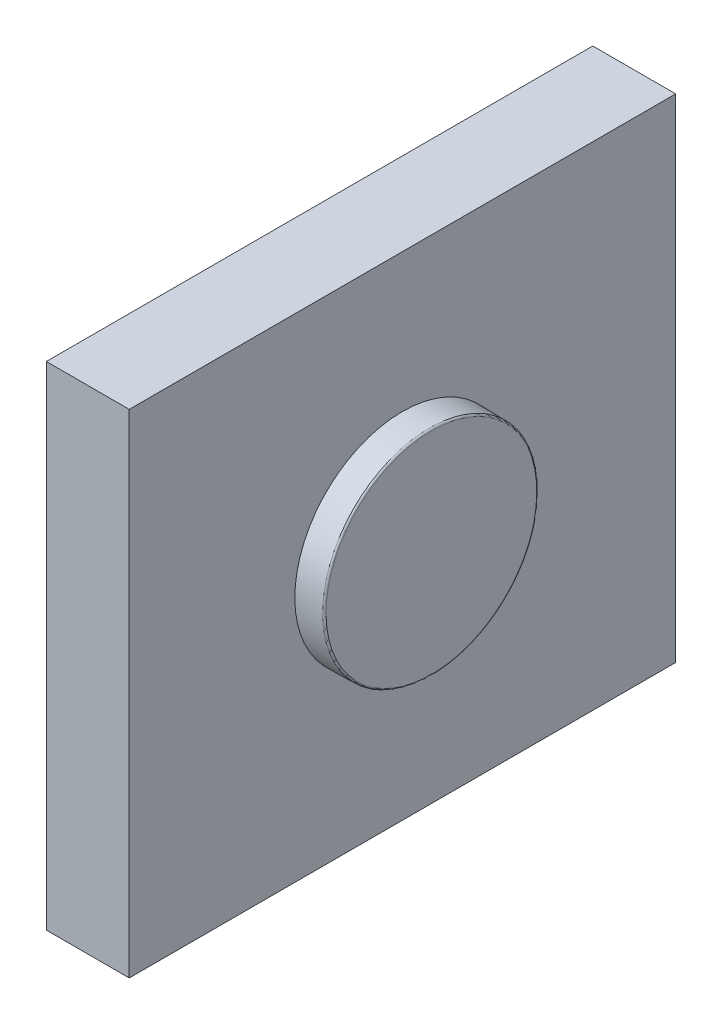
ISO-10303-21;
HEADER;
FILE_DESCRIPTION(('STEP AP214'),'2;1');
FILE_NAME('part.step','',(''),(''),'','','');
FILE_SCHEMA(('AUTOMOTIVE_DESIGN { 1 0 10303 214 1 1 1 1 }'));
ENDSEC;
DATA;
#1=APPLICATION_CONTEXT('core data for automotive mechanical design processes');
#2=APPLICATION_PROTOCOL_DEFINITION('international standard','automotive_design',2000,#1);
#3=PRODUCT_CONTEXT('',#1,'mechanical');
#4=PRODUCT('Part','Part','',(#3));
#5=PRODUCT_RELATED_PRODUCT_CATEGORY('part','',(#4));
#6=PRODUCT_DEFINITION_FORMATION('','',#4);
#7=PRODUCT_DEFINITION_CONTEXT('part definition',#1,'design');
#8=PRODUCT_DEFINITION('design','',#6,#7);
#9=PRODUCT_DEFINITION_SHAPE('','',#8);
#10=(LENGTH_UNIT() NAMED_UNIT(*) SI_UNIT(.MILLI.,.METRE.));
#11=(NAMED_UNIT(*) PLANE_ANGLE_UNIT() SI_UNIT($,.RADIAN.));
#12=(NAMED_UNIT(*) SI_UNIT($,.STERADIAN.) SOLID_ANGLE_UNIT());
#13=UNCERTAINTY_MEASURE_WITH_UNIT(LENGTH_MEASURE(1.E-05),#10,'distance_accuracy_value','');
#14=(GEOMETRIC_REPRESENTATION_CONTEXT(3) GLOBAL_UNCERTAINTY_ASSIGNED_CONTEXT((#13)) GLOBAL_UNIT_ASSIGNED_CONTEXT((#10,
#11,#12)) REPRESENTATION_CONTEXT('',''));
#15=CARTESIAN_POINT('',(0.,0.,0.));
#16=DIRECTION('',(0.,0.,1.));
#17=DIRECTION('',(1.,0.,0.));
#18=AXIS2_PLACEMENT_3D('',#15,#16,#17);
#19=CARTESIAN_POINT('',(3.30455824157118,-14.0999745457946,11.5154919140192));
#20=CARTESIAN_POINT('',(2.99733170822694,-14.0946118867074,11.5101292549321));
#21=CARTESIAN_POINT('',(2.99733170822694,-13.8773037425713,11.292821110796));
#22=CARTESIAN_POINT('',(3.30455824157118,-14.0902557384874,11.5252107213264));
#23=CARTESIAN_POINT('',(2.99733170822694,-14.0846590263841,11.5200821152553));
#24=CARTESIAN_POINT('',(2.99733170822694,-13.8578661279569,11.3122587254104));
#25=CARTESIAN_POINT('',(3.30458047281811,-14.0811745209178,11.5355671183712));
#26=CARTESIAN_POINT('',(2.99733170822694,-14.0753735914654,11.5307037719797));
#27=CARTESIAN_POINT('',(2.99733170822694,-13.839702916722,11.3329707434043));
#28=CARTESIAN_POINT('',(3.30466901694962,-14.0644426349507,11.5573778764094));
#29=CARTESIAN_POINT('',(2.99733170822694,-14.0583089623048,11.5530866657326));
#30=CARTESIAN_POINT('',(2.99733170822694,-13.8062360537007,11.3765891683934));
#31=CARTESIAN_POINT('',(3.30473533028792,-14.0567919812785,11.5688322487027));
#32=CARTESIAN_POINT('',(2.99733170822694,-14.0505288243675,11.564849600091));
#33=CARTESIAN_POINT('',(2.99733170822694,-13.790932431349,11.3994955979729));
#34=CARTESIAN_POINT('',(3.30491090350627,-14.0430521123824,11.5926429591094));
#35=CARTESIAN_POINT('',(2.99733170822694,-14.0366139478835,11.5892982140442));
#36=CARTESIAN_POINT('',(2.99733170822694,-13.763446564273,11.4471108895023));
#37=CARTESIAN_POINT('',(3.30502016424023,-14.0369629282086,11.6049993151525));
#38=CARTESIAN_POINT('',(2.99733170822694,-14.03047876267,11.6019857927267));
#39=CARTESIAN_POINT('',(2.99733170822694,-13.7512643816191,11.4718197872821));
#40=CARTESIAN_POINT('',(3.30527976238351,-14.0264501693481,11.6304025668908));
#41=CARTESIAN_POINT('',(2.99733170822694,-14.0199606767225,11.6280499980418));
#42=CARTESIAN_POINT('',(2.99733170822694,-13.7302298012931,11.5226172281539));
#43=CARTESIAN_POINT('',(3.30543010094776,-14.0220266415006,11.6434494819933));
#44=CARTESIAN_POINT('',(2.99733170822694,-14.0155778596557,11.6414285867946));
#45=CARTESIAN_POINT('',(2.99733170822694,-13.7213774972593,11.54870581002));
#46=CARTESIAN_POINT('',(3.30576928214731,-14.0149208676755,11.6700106154456));
#47=CARTESIAN_POINT('',(2.99733170822694,-14.0086371444044,11.6686293152508));
#48=CARTESIAN_POINT('',(2.99733170822694,-13.7071541087495,11.6018162360649));
#49=CARTESIAN_POINT('',(3.30595812610835,-14.0122386816659,11.683524849872));
#50=CARTESIAN_POINT('',(2.99733170822694,-14.0060798547881,11.6824533377279));
#51=CARTESIAN_POINT('',(2.99733170822694,-13.7017831441631,11.6288381123505));
#52=CARTESIAN_POINT('',(3.30637108680139,-14.0086614723867,11.7107893944333));
#53=CARTESIAN_POINT('',(2.99733170822694,-14.0028274535773,11.7102929101257));
#54=CARTESIAN_POINT('',(2.99733170822694,-13.6946143090933,11.6833527849617));
#55=CARTESIAN_POINT('',(3.30659520488778,-14.0077665177581,11.7245397136149));
#56=CARTESIAN_POINT('',(2.99733170822694,-14.0021334319874,11.7243101281065));
#57=CARTESIAN_POINT('',(2.99733170822694,-13.6928165758445,11.7108455993334));
#58=CARTESIAN_POINT('',(3.30707487912995,-14.0077790771294,11.7520411641532));
#59=CARTESIAN_POINT('',(2.99733170822694,-14.0026091944632,11.7522828706944));
#60=CARTESIAN_POINT('',(2.99733170822694,-13.692824949097,11.7658317549199));
#61=CARTESIAN_POINT('',(3.30733043653528,-14.008686662792,11.7657922955205));
#62=CARTESIAN_POINT('',(2.99733170822694,-14.003780472096,11.7662397302609));
#63=CARTESIAN_POINT('',(2.99733170822694,-13.69463119888,11.7933250961123));
#64=CARTESIAN_POINT('',(3.30786861691192,-14.0122887727411,11.7930600945936));
#65=CARTESIAN_POINT('',(2.99733170822694,-14.0079534272236,11.7938425689324));
#66=CARTESIAN_POINT('',(2.99733170822694,-13.7018166308313,11.8478419063117));
#67=CARTESIAN_POINT('',(3.30815124092218,-14.0149833656439,11.8065767532758));
#68=CARTESIAN_POINT('',(2.99733170822694,-14.0109568957503,11.8074894569731));
#69=CARTESIAN_POINT('',(2.99733170822694,-13.707195950196,11.8748653572352));
#70=CARTESIAN_POINT('',(3.30873871898789,-14.0221133901359,11.8331443424987));
#71=CARTESIAN_POINT('',(2.99733170822694,-14.018727202453,11.8342321845069));
#72=CARTESIAN_POINT('',(2.99733170822694,-13.7214354902445,11.9279800267454));
#73=CARTESIAN_POINT('',(3.3090435738083,-14.0265488816513,11.8461952569904));
#74=CARTESIAN_POINT('',(2.99733170822694,-14.0234960029918,11.8473284458178));
#75=CARTESIAN_POINT('',(2.99733170822694,-13.7302958307539,11.9540712132075));
#76=CARTESIAN_POINT('',(3.30967029765055,-14.0370848217454,11.871608059793));
#77=CARTESIAN_POINT('',(2.99733170822694,-14.0346984679467,11.8727433751853));
#78=CARTESIAN_POINT('',(2.99733170822694,-13.7513458319314,12.004874939802));
#79=CARTESIAN_POINT('',(3.30999216715035,-14.0431853171168,11.8839699287275));
#80=CARTESIAN_POINT('',(2.99733170822694,-14.0411341293682,11.8850619524873));
#81=CARTESIAN_POINT('',(2.99733170822694,-13.7635355861681,12.0295874411649));
#82=CARTESIAN_POINT('',(3.31064741338044,-14.0569468987431,11.9077931279435));
#83=CARTESIAN_POINT('',(2.99733170822694,-14.0555431276732,11.9087126990408));
#84=CARTESIAN_POINT('',(2.99733170822694,-13.7910358746898,12.0772109648659));
#85=CARTESIAN_POINT('',(3.31098079033928,-14.0646080160096,11.9192544403235));
#86=CARTESIAN_POINT('',(2.99733170822694,-14.0635183589527,11.9200442762058));
#87=CARTESIAN_POINT('',(2.99733170822694,-13.80634647099,12.100121951393));
#88=CARTESIAN_POINT('',(3.31165334756795,-14.0813597746928,11.9410804175859));
#89=CARTESIAN_POINT('',(2.99733170822694,-14.0808539466462,11.9415334526264));
#90=CARTESIAN_POINT('',(2.99733170822694,-13.8398265092961,12.1437504268576));
#91=CARTESIAN_POINT('',(3.31199252789744,-14.0904504308138,11.951445071186));
#92=CARTESIAN_POINT('',(2.99733170822694,-14.0902159667458,11.9516900047324));
#93=CARTESIAN_POINT('',(2.99733170822694,-13.8579959807088,12.1644678932285));
#94=CARTESIAN_POINT('',(3.31267088855643,-14.109905740535,11.9709003809072));
#95=CARTESIAN_POINT('',(2.99733170822694,-14.1101509372219,11.9706656635041));
#96=CARTESIAN_POINT('',(2.99733170822694,-13.8968829184925,12.2033548310122));
#97=CARTESIAN_POINT('',(3.31301006888592,-14.1202703941352,11.9799910370282));
#98=CARTESIAN_POINT('',(2.99733170822694,-14.120725210342,11.9794833451178));
#99=CARTESIAN_POINT('',(2.99733170822694,-13.9176003848635,12.2215243024249));
#100=CARTESIAN_POINT('',(3.31368262611459,-14.1420963713975,11.9967427957114));
#101=CARTESIAN_POINT('',(2.99733170822694,-14.1428928220549,11.9956440617984));
#102=CARTESIAN_POINT('',(2.99733170822694,-13.961228860328,12.2550043407311));
#103=CARTESIAN_POINT('',(3.31401600307344,-14.1535576837775,12.004403912978));
#104=CARTESIAN_POINT('',(2.99733170822694,-14.1544870572149,12.0029853957888));
#105=CARTESIAN_POINT('',(2.99733170822694,-13.9841398468551,12.2703149370312));
#106=CARTESIAN_POINT('',(3.31467124930352,-14.1773808829935,12.0181654946043));
#107=CARTESIAN_POINT('',(2.99733170822694,-14.1784891497553,12.0160839494885));
#108=CARTESIAN_POINT('',(2.99733170822694,-14.0317633705561,12.2978152255529));
#109=CARTESIAN_POINT('',(3.31499311880332,-14.189742751928,12.0242659899756));
#110=CARTESIAN_POINT('',(2.99733170822694,-14.190897422397,12.021839311037));
#111=CARTESIAN_POINT('',(2.99733170822694,-14.056475871919,12.3100049797896));
#112=CARTESIAN_POINT('',(3.31561984264557,-14.2151555547306,12.0348019300698));
#113=CARTESIAN_POINT('',(2.99733170822694,-14.2163126433581,12.0316849826122));
#114=CARTESIAN_POINT('',(2.99733170822694,-14.1072795985135,12.3310549809672));
#115=CARTESIAN_POINT('',(3.31592469746598,-14.2282064692223,12.0392374215851));
#116=CARTESIAN_POINT('',(2.99733170822694,-14.2293195034521,12.0357734048924));
#117=CARTESIAN_POINT('',(2.99733170822694,-14.1333707849756,12.3399153214765));
#118=CARTESIAN_POINT('',(3.3165121755317,-14.2547740584452,12.0463674460772));
#119=CARTESIAN_POINT('',(2.99733170822694,-14.2557113898018,12.0422329742294));
#120=CARTESIAN_POINT('',(2.99733170822694,-14.1864854544858,12.354154861525));
#121=CARTESIAN_POINT('',(3.31679479954195,-14.2682907171274,12.04906203898));
#122=CARTESIAN_POINT('',(2.99733170822694,-14.2690958356381,12.0446023312957));
#123=CARTESIAN_POINT('',(2.99733170822694,-14.2135089054093,12.3595341808897));
#124=CARTESIAN_POINT('',(3.3173329799186,-14.2955585162005,12.0526641489291));
#125=CARTESIAN_POINT('',(2.99733170822694,-14.2960205296551,12.0475999082714));
#126=CARTESIAN_POINT('',(2.99733170822694,-14.2680257156087,12.366719612841));
#127=CARTESIAN_POINT('',(3.31758853732392,-14.3093096475678,12.0535717345917));
#128=CARTESIAN_POINT('',(2.99733170822694,-14.3095597483079,12.0482265548042));
#129=CARTESIAN_POINT('',(2.99733170822694,-14.2955190568011,12.3685258626241));
#130=CARTESIAN_POINT('',(3.31806821156609,-14.3368110981062,12.053584293963));
#131=CARTESIAN_POINT('',(2.99733170822694,-14.3365731772341,12.0477424198455));
#132=CARTESIAN_POINT('',(2.99733170822694,-14.3505052123877,12.3685342358766));
#133=CARTESIAN_POINT('',(3.31829232965248,-14.3505614172877,12.0526893393343));
#134=CARTESIAN_POINT('',(2.99733170822694,-14.3500459801195,12.0466303845373));
#135=CARTESIAN_POINT('',(2.99733170822694,-14.3779980267593,12.3667365026278));
#136=CARTESIAN_POINT('',(3.31870529034552,-14.377825961849,12.0491121300551));
#137=CARTESIAN_POINT('',(2.99733170822694,-14.3767103868924,12.0426990405606));
#138=CARTESIAN_POINT('',(2.99733170822694,-14.4325126993705,12.359567667558));
#139=CARTESIAN_POINT('',(3.31889413430657,-14.3913401962755,12.0464299440455));
#140=CARTESIAN_POINT('',(2.99733170822694,-14.3899002997207,12.0398788785423));
#141=CARTESIAN_POINT('',(2.99733170822694,-14.4595345756561,12.3541967029716));
#142=CARTESIAN_POINT('',(3.31923331550611,-14.4179013297278,12.0393241702205));
#143=CARTESIAN_POINT('',(2.99733170822694,-14.4157900746607,12.0325865239954));
#144=CARTESIAN_POINT('',(2.99733170822694,-14.512645001701,12.3399733144618));
#145=CARTESIAN_POINT('',(3.31938365407036,-14.4309482448302,12.0349006423729));
#146=CARTESIAN_POINT('',(2.99733170822694,-14.4284880727735,12.0281139329069));
#147=CARTESIAN_POINT('',(2.99733170822694,-14.5387335835671,12.3311210104279));
#148=CARTESIAN_POINT('',(3.31964325221364,-14.4563514965686,12.0243878835124));
#149=CARTESIAN_POINT('',(2.99733170822694,-14.4531948973129,12.0175955547803));
#150=CARTESIAN_POINT('',(2.99733170822694,-14.589531024439,12.3100864301019));
#151=CARTESIAN_POINT('',(3.3197525129476,-14.4687078526117,12.0182986993386));
#152=CARTESIAN_POINT('',(2.99733170822694,-14.4652018069409,12.0115498489016));
#153=CARTESIAN_POINT('',(2.99733170822694,-14.6142399222187,12.297904247448));
#154=CARTESIAN_POINT('',(3.31992808616596,-14.4925185630183,12.0045588304426));
#155=CARTESIAN_POINT('',(2.99733170822694,-14.488339174554,11.9979861058774));
#156=CARTESIAN_POINT('',(2.99733170822694,-14.6618552137481,12.270418380372));
#157=CARTESIAN_POINT('',(3.31999439950425,-14.5039729353117,11.9969081767704));
#158=CARTESIAN_POINT('',(2.99733170822694,-14.499467785049,11.9904686241233));
#159=CARTESIAN_POINT('',(2.99733170822694,-14.6847616433276,12.2551147580204));
#160=CARTESIAN_POINT('',(3.32008294363576,-14.5257836933498,11.9801762908033));
#161=CARTESIAN_POINT('',(2.99733170822694,-14.520675006054,11.9740826464054));
#162=CARTESIAN_POINT('',(2.99733170822694,-14.7283800683168,12.221647894999));
#163=CARTESIAN_POINT('',(3.3201051748827,-14.5361400903946,11.9710950732337));
#164=CARTESIAN_POINT('',(2.99733170822694,-14.5307519551113,11.9652151448818));
#165=CARTESIAN_POINT('',(2.99733170822694,-14.7490920863106,12.2034846837641));
#166=CARTESIAN_POINT('',(3.3201051748827,-14.555577705009,11.9516574586193));
#167=CARTESIAN_POINT('',(2.99733170822694,-14.5496977766572,11.9462693233359));
#168=CARTESIAN_POINT('',(2.99733170822694,-14.7879673155394,12.1646094545353));
#169=CARTESIAN_POINT('',(3.32008294363576,-14.5646589225786,11.9413010615745));
#170=CARTESIAN_POINT('',(2.99733170822694,-14.5585652781807,11.9361923742787));
#171=CARTESIAN_POINT('',(2.99733170822694,-14.8061305267743,12.1438974365414));
#172=CARTESIAN_POINT('',(3.31999439950425,-14.5813908085457,11.9194903035364));
#173=CARTESIAN_POINT('',(2.99733170822694,-14.5749512558986,11.9149851532737));
#174=CARTESIAN_POINT('',(2.99733170822694,-14.8395973897957,12.1002790115523));
#175=CARTESIAN_POINT('',(3.31992808616596,-14.5890414622179,11.908035931243));
#176=CARTESIAN_POINT('',(2.99733170822694,-14.5824687376527,11.9038565427787));
#177=CARTESIAN_POINT('',(2.99733170822694,-14.8549010121473,12.0773725819728));
#178=CARTESIAN_POINT('',(3.3197525129476,-14.602781331114,11.8842252208364));
#179=CARTESIAN_POINT('',(2.99733170822694,-14.5960324806769,11.8807191751656));
#180=CARTESIAN_POINT('',(2.99733170822694,-14.8823868792233,12.0297572904434));
#181=CARTESIAN_POINT('',(3.31964325221364,-14.6088705152877,11.8718688647933));
#182=CARTESIAN_POINT('',(2.99733170822694,-14.6020781865556,11.8687122655376));
#183=CARTESIAN_POINT('',(2.99733170822694,-14.8945690618772,12.0050483926636));
#184=CARTESIAN_POINT('',(3.31938365407036,-14.6193832741483,11.8464656130549));
#185=CARTESIAN_POINT('',(2.99733170822694,-14.6125965646822,11.8440054409981));
#186=CARTESIAN_POINT('',(2.99733170822694,-14.9156036422032,11.9542509517918));
#187=CARTESIAN_POINT('',(3.31923331550611,-14.6238068019958,11.8334186979524));
#188=CARTESIAN_POINT('',(2.99733170822694,-14.6170691557708,11.8313074428854));
#189=CARTESIAN_POINT('',(2.99733170822694,-14.9244559462371,11.9281623699257));
#190=CARTESIAN_POINT('',(3.31889413430657,-14.6309125758208,11.8068575645001));
#191=CARTESIAN_POINT('',(2.99733170822694,-14.6243615103176,11.8054176679454));
#192=CARTESIAN_POINT('',(2.99733170822694,-14.9386793347469,11.8750519438808));
#193=CARTESIAN_POINT('',(3.31870529034552,-14.6335947618304,11.7933433300737));
#194=CARTESIAN_POINT('',(2.99733170822694,-14.627181672336,11.792227755117));
#195=CARTESIAN_POINT('',(2.99733170822694,-14.9440502993333,11.8480300675952));
#196=CARTESIAN_POINT('',(3.31829232965248,-14.6371719711096,11.7660787855124));
#197=CARTESIAN_POINT('',(2.99733170822694,-14.6311130163126,11.7655633483442));
#198=CARTESIAN_POINT('',(2.99733170822694,-14.9512191344031,11.793515394984));
#199=CARTESIAN_POINT('',(3.31806821156609,-14.6380669257383,11.7523284663308));
#200=CARTESIAN_POINT('',(2.99733170822694,-14.6322250516209,11.7520905454588));
#201=CARTESIAN_POINT('',(2.99733170822694,-14.9530168676519,11.7660225806123));
#202=CARTESIAN_POINT('',(3.31758853732392,-14.638054366367,11.7248270157925));
#203=CARTESIAN_POINT('',(2.99733170822694,-14.6327091865795,11.7250771165326));
#204=CARTESIAN_POINT('',(2.99733170822694,-14.9530084943994,11.7110364250258));
#205=CARTESIAN_POINT('',(3.3173329799186,-14.6371467807044,11.7110758844252));
#206=CARTESIAN_POINT('',(2.99733170822694,-14.6320825400467,11.7115378978798));
#207=CARTESIAN_POINT('',(2.99733170822694,-14.9512022446164,11.6835430838334));
#208=CARTESIAN_POINT('',(3.31679479954195,-14.6335446707553,11.6838080853521));
#209=CARTESIAN_POINT('',(2.99733170822694,-14.629084963071,11.6846132038628));
#210=CARTESIAN_POINT('',(2.99733170822694,-14.944016812665,11.629026273634));
#211=CARTESIAN_POINT('',(3.3165121755317,-14.6308500778525,11.6702914266699));
#212=CARTESIAN_POINT('',(2.99733170822694,-14.6267156060047,11.6712287580265));
#213=CARTESIAN_POINT('',(2.99733170822694,-14.9386374933003,11.6020028227105));
#214=CARTESIAN_POINT('',(3.31592469746598,-14.6237200533604,11.643723837447));
#215=CARTESIAN_POINT('',(2.99733170822694,-14.6202560366677,11.6448368716768));
#216=CARTESIAN_POINT('',(2.99733170822694,-14.9243979532518,11.5488881532003));
#217=CARTESIAN_POINT('',(3.31561984264557,-14.6192845618451,11.6306729229553));
#218=CARTESIAN_POINT('',(2.99733170822694,-14.6161676143876,11.6318300115828));
#219=CARTESIAN_POINT('',(2.99733170822694,-14.9155376127425,11.5227969667382));
#220=CARTESIAN_POINT('',(3.31499311880332,-14.608748621751,11.6052601201527));
#221=CARTESIAN_POINT('',(2.99733170822694,-14.6063219428123,11.6064147906217));
#222=CARTESIAN_POINT('',(2.99733170822694,-14.8944876115649,11.4719932401437));
#223=CARTESIAN_POINT('',(3.31467124930352,-14.6026481263796,11.5928982512182));
#224=CARTESIAN_POINT('',(2.99733170822694,-14.6005665812638,11.59400651798));
#225=CARTESIAN_POINT('',(2.99733170822694,-14.8822978573282,11.4472807387808));
#226=CARTESIAN_POINT('',(3.31401600307344,-14.5888865447533,11.5690750520022));
#227=CARTESIAN_POINT('',(2.99733170822694,-14.5874680275641,11.5700044254396));
#228=CARTESIAN_POINT('',(2.99733170822694,-14.8547975688066,11.3996572150798));
#229=CARTESIAN_POINT('',(3.31368262611459,-14.5812254274867,11.5576137396222));
#230=CARTESIAN_POINT('',(2.99733170822694,-14.5801266935737,11.5584101902796));
#231=CARTESIAN_POINT('',(2.99733170822694,-14.8394869725064,11.3767462285527));
#232=CARTESIAN_POINT('',(3.31301006888592,-14.5644736688036,11.5357877623599));
#233=CARTESIAN_POINT('',(2.99733170822694,-14.5639659768931,11.5362425785667));
#234=CARTESIAN_POINT('',(2.99733170822694,-14.8060069342002,11.3331177530882));
#235=CARTESIAN_POINT('',(3.31267088855643,-14.5553830126825,11.5254231087597));
#236=CARTESIAN_POINT('',(2.99733170822694,-14.5551482952794,11.5256683054466));
#237=CARTESIAN_POINT('',(2.99733170822694,-14.7878374627875,11.3124002867172));
#238=CARTESIAN_POINT('',(3.31199252789744,-14.5359277029613,11.5059677990385));
#239=CARTESIAN_POINT('',(2.99733170822694,-14.5361726365077,11.5057333349705));
#240=CARTESIAN_POINT('',(2.99733170822694,-14.7489505250039,11.2735133489335));
#241=CARTESIAN_POINT('',(3.31165334756795,-14.5255630493612,11.4968771429175));
#242=CARTESIAN_POINT('',(2.99733170822694,-14.5260160844017,11.4963713148709));
#243=CARTESIAN_POINT('',(2.99733170822694,-14.7282330586329,11.2553438775208));
#244=CARTESIAN_POINT('',(3.31098079033928,-14.5037370720988,11.4801253842343));
#245=CARTESIAN_POINT('',(2.99733170822694,-14.5045269079811,11.4790357271774));
#246=CARTESIAN_POINT('',(2.99733170822694,-14.6846045831683,11.2218638392147));
#247=CARTESIAN_POINT('',(3.31064741338044,-14.4922757597188,11.4724642669678));
#248=CARTESIAN_POINT('',(2.99733170822694,-14.4931953308162,11.4710604958978));
#249=CARTESIAN_POINT('',(2.99733170822694,-14.6616935966412,11.2065532429145));
#250=CARTESIAN_POINT('',(3.30999216715035,-14.4684525605028,11.4587026853414));
#251=CARTESIAN_POINT('',(2.99733170822694,-14.4695445842627,11.4566514975928));
#252=CARTESIAN_POINT('',(2.99733170822694,-14.6140700729402,11.1790529543928));
#253=CARTESIAN_POINT('',(3.30967029765055,-14.4560906915683,11.4526021899701));
#254=CARTESIAN_POINT('',(2.99733170822694,-14.4572260069606,11.4502158361714));
#255=CARTESIAN_POINT('',(2.99733170822694,-14.5893575715773,11.1668632001561));
#256=CARTESIAN_POINT('',(3.3090435738083,-14.4306778887657,11.4420662498759));
#257=CARTESIAN_POINT('',(2.99733170822694,-14.4318110775931,11.4390133712165));
#258=CARTESIAN_POINT('',(2.99733170822694,-14.5385538449828,11.1458131989786));
#259=CARTESIAN_POINT('',(3.30873871898789,-14.417626974274,11.4376307583606));
#260=CARTESIAN_POINT('',(2.99733170822694,-14.4187148162822,11.4342445706777));
#261=CARTESIAN_POINT('',(2.99733170822694,-14.5124626585207,11.1369528584692));
#262=CARTESIAN_POINT('',(3.30815124092218,-14.3910593850511,11.4305007338686));
#263=CARTESIAN_POINT('',(2.99733170822694,-14.3919720887484,11.4264742639749));
#264=CARTESIAN_POINT('',(2.99733170822694,-14.4593479890105,11.1227133184207));
#265=CARTESIAN_POINT('',(3.30786861691192,-14.3775427263689,11.4278061409657));
#266=CARTESIAN_POINT('',(2.99733170822694,-14.3783252007077,11.4234707954483));
#267=CARTESIAN_POINT('',(2.99733170822694,-14.432324538087,11.117333999056));
#268=CARTESIAN_POINT('',(3.30733043653528,-14.3502749272958,11.4242040310167));
#269=CARTESIAN_POINT('',(2.99733170822694,-14.3507223620362,11.4192978403206));
#270=CARTESIAN_POINT('',(2.99733170822694,-14.3778077278877,11.1101485671047));
#271=CARTESIAN_POINT('',(3.30707487912995,-14.3365237959285,11.423296445354));
#272=CARTESIAN_POINT('',(2.99733170822694,-14.3367655024697,11.4181265626879));
#273=CARTESIAN_POINT('',(2.99733170822694,-14.3503143866953,11.1083423173216));
#274=CARTESIAN_POINT('',(3.30659520488778,-14.3090223453902,11.4232838859828));
#275=CARTESIAN_POINT('',(2.99733170822694,-14.3087927598819,11.4176508002121));
#276=CARTESIAN_POINT('',(2.99733170822694,-14.2953282311087,11.1083339440692));
#277=CARTESIAN_POINT('',(3.30637108680139,-14.2952720262086,11.4241788406114));
#278=CARTESIAN_POINT('',(2.99733170822694,-14.294775541901,11.418344821802));
#279=CARTESIAN_POINT('',(2.99733170822694,-14.267835416737,11.1101316773179));
#280=CARTESIAN_POINT('',(3.30595812610835,-14.2680074816473,11.4277560498906));
#281=CARTESIAN_POINT('',(2.99733170822694,-14.2669359695032,11.4215972230128));
#282=CARTESIAN_POINT('',(2.99733170822694,-14.2133207441258,11.1173005123878));
#283=CARTESIAN_POINT('',(3.30576928214731,-14.2544932472209,11.4304382359002));
#284=CARTESIAN_POINT('',(2.99733170822694,-14.2531119470261,11.4241545126291));
#285=CARTESIAN_POINT('',(2.99733170822694,-14.1862988678402,11.1226714769741));
#286=CARTESIAN_POINT('',(3.30543010094776,-14.2279321137686,11.4375440097252));
#287=CARTESIAN_POINT('',(2.99733170822694,-14.22591121857,11.4310952278804));
#288=CARTESIAN_POINT('',(2.99733170822694,-14.1331884417953,11.136894865484));
#289=CARTESIAN_POINT('',(3.30527976238351,-14.2148851986661,11.4419675375728));
#290=CARTESIAN_POINT('',(2.99733170822694,-14.2125326298171,11.4354780449472));
#291=CARTESIAN_POINT('',(2.99733170822694,-14.1070998599292,11.1457471695178));
#292=CARTESIAN_POINT('',(3.30502016424023,-14.1894819469278,11.4524802964333));
#293=CARTESIAN_POINT('',(2.99733170822694,-14.186468424502,11.4459961308946));
#294=CARTESIAN_POINT('',(2.99733170822694,-14.0563024190574,11.1667817498438));
#295=CARTESIAN_POINT('',(3.30491090350627,-14.1771255908847,11.4585694806071));
#296=CARTESIAN_POINT('',(2.99733170822694,-14.1737808458195,11.4521313161082));
#297=CARTESIAN_POINT('',(2.99733170822694,-14.0315935212776,11.1789639324977));
#298=CARTESIAN_POINT('',(3.30473533028792,-14.153314880478,11.4723093495031));
#299=CARTESIAN_POINT('',(2.99733170822694,-14.1493322318663,11.4660461925922));
#300=CARTESIAN_POINT('',(2.99733170822694,-13.9839782297482,11.2064497995737));
#301=CARTESIAN_POINT('',(3.30466901694962,-14.1418605081847,11.4799600031753));
#302=CARTESIAN_POINT('',(2.99733170822694,-14.1375692975079,11.4738263305294));
#303=CARTESIAN_POINT('',(2.99733170822694,-13.9610718001687,11.2217534219254));
#304=CARTESIAN_POINT('',(3.30458047281811,-14.1200497501465,11.4966918891425));
#305=CARTESIAN_POINT('',(2.99733170822694,-14.115186403755,11.4908909596901));
#306=CARTESIAN_POINT('',(2.99733170822694,-13.9174533751796,11.2552202849467));
#307=CARTESIAN_POINT('',(3.30455824157118,-14.1096933531018,11.5057731067121));
#308=CARTESIAN_POINT('',(2.99733170822694,-14.1045647470306,11.5001763946088));
#309=CARTESIAN_POINT('',(2.99733170822694,-13.8967413571857,11.2733834961816));
#310=CARTESIAN_POINT('',(3.30455824157118,-14.0999745457946,11.5154919140192));
#311=CARTESIAN_POINT('',(2.99733170822694,-14.0946118867074,11.5101292549321));
#312=CARTESIAN_POINT('',(2.99733170822694,-13.8773037425713,11.292821110796));
#313=(BOUNDED_SURFACE() B_SPLINE_SURFACE(3,2,((#19,#20,#21),(#22,#23,#24),(#25,#26,#27),(#28,
#29,#30),(#31,#32,#33),(#34,#35,#36),(#37,#38,#39),(#40,#41,#42),(#43,#44,#45),(#46,#47,#48),
(#49,#50,#51),(#52,#53,#54),(#55,#56,#57),(#58,#59,#60),(#61,#62,#63),(#64,#65,#66),(#67,#68,
#69),(#70,#71,#72),(#73,#74,#75),(#76,#77,#78),(#79,#80,#81),(#82,#83,#84),(#85,#86,#87),(#88,
#89,#90),(#91,#92,#93),(#94,#95,#96),(#97,#98,#99),(#100,#101,#102),(#103,#104,#105),(#106,#107,
#108),(#109,#110,#111),(#112,#113,#114),(#115,#116,#117),(#118,#119,#120),(#121,#122,#123),
(#124,#125,#126),(#127,#128,#129),(#130,#131,#132),(#133,#134,#135),(#136,#137,#138),(#139,#140,
#141),(#142,#143,#144),(#145,#146,#147),(#148,#149,#150),(#151,#152,#153),(#154,#155,#156),
(#157,#158,#159),(#160,#161,#162),(#163,#164,#165),(#166,#167,#168),(#169,#170,#171),(#172,#173,
#174),(#175,#176,#177),(#178,#179,#180),(#181,#182,#183),(#184,#185,#186),(#187,#188,#189),
(#190,#191,#192),(#193,#194,#195),(#196,#197,#198),(#199,#200,#201),(#202,#203,#204),(#205,#206,
#207),(#208,#209,#210),(#211,#212,#213),(#214,#215,#216),(#217,#218,#219),(#220,#221,#222),
(#223,#224,#225),(#226,#227,#228),(#229,#230,#231),(#232,#233,#234),(#235,#236,#237),(#238,#239,
#240),(#241,#242,#243),(#244,#245,#246),(#247,#248,#249),(#250,#251,#252),(#253,#254,#255),
(#256,#257,#258),(#259,#260,#261),(#262,#263,#264),(#265,#266,#267),(#268,#269,#270),(#271,#272,
#273),(#274,#275,#276),(#277,#278,#279),(#280,#281,#282),(#283,#284,#285),(#286,#287,#288),
(#289,#290,#291),(#292,#293,#294),(#295,#296,#297),(#298,#299,#300),(#301,#302,#303),(#304,#305,
#306),(#307,#308,#309),(#310,#311,#312)),.UNSPECIFIED.,.T.,.F.,
.F.) B_SPLINE_SURFACE_WITH_KNOTS((4,2,2,2,2,2,2,2,2,2,2,2,2,2,2,2,2,2,2,2,2,2,2,2,2,2,2,2,2,2,2,
2,2,2,2,2,2,2,2,2,2,2,2,2,2,2,2,2,4),(3,3),(0.,0.082408050231093,0.16481694867164,
0.247227485702298,0.329640339993695,0.412056032249538,0.494474889728135,0.576897023958396,
0.659322323164037,0.741750459905647,0.824180913413239,0.90661300508247,0.989045944713775,
1.07147888434508,1.15391097601431,1.2363414295219,1.31876956626351,1.40119486546915,
1.48361699969941,1.56603585717801,1.64845154943385,1.73086440372525,1.81327494075591,
1.89568383919646,1.97809188942755,2.06049993965864,2.14290883809919,2.22531937512985,
2.30773222942124,2.39014792167709,2.47256677915568,2.55498891338595,2.63741421259158,
2.7198423493332,2.80227280284079,2.88470489451002,2.96713783414132,3.04957077377263,
3.13200286544186,3.21443331894945,3.29686145569106,3.3792867548967,3.46170888912696,
3.54412774660556,3.6265434388614,3.7089562931528,3.79136683018346,3.873775728624,
3.9561837788551),(0.,1.),
.UNSPECIFIED.) GEOMETRIC_REPRESENTATION_ITEM() RATIONAL_B_SPLINE_SURFACE(((1.,0.715778482466135,
1.),(1.,0.715778482466135,1.),(1.,0.715753833868982,1.),(1.,0.715655646535189,1.),(1.,
0.715582107295334,1.),(1.,0.715387352806817,1.),(1.,0.71526613661021,1.),(1.,0.714978031499939,
1.),(1.,0.714811141302122,1.),(1.,0.714434450975085,1.),(1.,0.714224649368419,1.),(1.,
0.713765617309684,1.),(1.,0.713516385343637,1.),(1.,0.712982639560073,1.),(1.,0.712698124340239,
1.),(1.,0.712098561803638,1.),(1.,0.711783513314872,1.),(1.,0.711128163431651,1.),(1.,
0.710787861168225,1.),(1.,0.710087729595666,1.),(1.,0.709727899737965,1.),(1.,0.708994794200322,
1.),(1.,0.708621518253308,1.),(1.,0.707867858380458,1.),(1.,0.707487474381542,1.),(1.,
0.706726087991553,1.),(1.,0.706345085600479,1.),(1.,0.705588994264329,1.),(1.,0.705213905258464,
1.),(1.,0.704476102404387,1.),(1.,0.704113388310393,1.),(1.,0.703406613526652,1.),(1.,
0.703062552312924,1.),(1.,0.702399065867517,1.),(1.,0.702079639788169,1.),(1.,0.701471001675621,
1.),(1.,0.701181788482731,1.),(1.,0.700638646504842,1.),(1.,0.700384716317543,1.),(1.,
0.699916607781164,1.),(1.,0.699702427905825,1.),(1.,0.699317599454815,1.),(1.,0.699146949380409,
1.),(1.,0.698852199255561,1.),(1.,0.698728097896375,1.),(1.,0.698528644529639,1.),(1.,
0.698453291552842,1.),(1.,0.698352671854052,1.),(1.,0.698327404616543,1.),(1.,0.698327404616543,
1.),(1.,0.698352671854052,1.),(1.,0.698453291552842,1.),(1.,0.698528644529639,1.),(1.,
0.698728097896375,1.),(1.,0.698852199255561,1.),(1.,0.699146949380409,1.),(1.,0.699317599454815,
1.),(1.,0.699702427905825,1.),(1.,0.699916607781164,1.),(1.,0.700384716317543,1.),(1.,
0.700638646504842,1.),(1.,0.701181788482731,1.),(1.,0.701471001675621,1.),(1.,0.702079639788169,
1.),(1.,0.702399065867518,1.),(1.,0.703062552312924,1.),(1.,0.703406613526652,1.),(1.,
0.704113388310393,1.),(1.,0.704476102404387,1.),(1.,0.705213905258464,1.),(1.,0.705588994264329,
1.),(1.,0.706345085600479,1.),(1.,0.706726087991553,1.),(1.,0.707487474381542,1.),(1.,
0.707867858380458,1.),(1.,0.708621518253308,1.),(1.,0.708994794200322,1.),(1.,0.709727899737965,
1.),(1.,0.710087729595666,1.),(1.,0.710787861168225,1.),(1.,0.711128163431651,1.),(1.,
0.711783513314872,1.),(1.,0.712098561803638,1.),(1.,0.712698124340239,1.),(1.,0.712982639560073,
1.),(1.,0.713516385343637,1.),(1.,0.713765617309684,1.),(1.,0.714224649368419,1.),(1.,
0.714434450975085,1.),(1.,0.714811141302122,1.),(1.,0.714978031499939,1.),(1.,0.71526613661021,
1.),(1.,0.715387352806817,1.),(1.,0.715582107295334,1.),(1.,0.715655646535189,1.),(1.,
0.715753833868982,1.),(1.,0.715778482466135,1.),(1.,0.715778482466135,1.))) REPRESENTATION_ITEM('') SURFACE());
#314=CARTESIAN_POINT('',(2.9981178531854,-14.975230678364,11.7331736822297));
#315=CARTESIAN_POINT('',(3.01620558276822,-15.2324646044217,11.934527838102));
#316=CARTESIAN_POINT('',(2.68940150429625,-15.2458011929031,11.9267057881607));
#317=CARTESIAN_POINT('',(2.99783968951035,-14.9713828022377,11.7427916398663));
#318=CARTESIAN_POINT('',(3.01278984863509,-15.2264294617777,11.9423458627476));
#319=CARTESIAN_POINT('',(2.68884517806609,-15.2379009235372,11.9368490715194));
#320=CARTESIAN_POINT('',(2.99764308393129,-14.9674276601913,11.7525692617771));
#321=CARTESIAN_POINT('',(3.00949435698679,-15.2201885053103,11.9504130608206));
#322=CARTESIAN_POINT('',(2.68845196744198,-15.2299845434874,11.9469875456374));
#323=CARTESIAN_POINT('',(2.99738910270893,-14.9592598530574,11.7724343456522));
#324=CARTESIAN_POINT('',(3.00319873135287,-15.2073613676677,11.9669534965554));
#325=CARTESIAN_POINT('',(2.68794400543991,-15.2141290799712,11.9672440380184));
#326=CARTESIAN_POINT('',(2.99733164087084,-14.955047349056,11.7825216118781));
#327=CARTESIAN_POINT('',(3.00019540205761,-15.2007780135112,11.975423474563));
#328=CARTESIAN_POINT('',(2.68782908167277,-15.2061900136117,11.9773620650637));
#329=CARTESIAN_POINT('',(2.99733186578278,-14.9404716863137,11.8167258231229));
#330=CARTESIAN_POINT('',(2.99073381540766,-15.1783593021113,12.004194655342));
#331=CARTESIAN_POINT('',(2.6878295310612,-15.1796419453877,12.0111163779756));
#332=CARTESIAN_POINT('',(2.99764679988872,-14.9294262288932,11.8415409609662));
#333=CARTESIAN_POINT('',(2.98487079095874,-15.1616371827411,12.0255425290245));
#334=CARTESIAN_POINT('',(2.68845939875228,-15.1609815485971,12.0347108278366));
#335=CARTESIAN_POINT('',(2.99856693142854,-14.904986177689,11.892582130563));
#336=CARTESIAN_POINT('',(2.97491189223467,-15.1265290002825,12.0700797061108));
#337=CARTESIAN_POINT('',(2.69029966348077,-15.1235525899636,12.0817945364924));
#338=CARTESIAN_POINT('',(2.999172223195,-14.8915908213583,11.9188086183813));
#339=CARTESIAN_POINT('',(2.97076972035731,-15.1081206720566,12.0933020647256));
#340=CARTESIAN_POINT('',(2.69151024918423,-15.1047839949279,12.1052837585954));
#341=CARTESIAN_POINT('',(3.00032812404751,-14.8618495613136,11.9719143310516));
#342=CARTESIAN_POINT('',(2.96422323748085,-15.0700179950547,12.1410654781956));
#343=CARTESIAN_POINT('',(2.69382204490088,-15.0671260420912,12.1521921512371));
#344=CARTESIAN_POINT('',(3.00087870528665,-14.8455021668581,11.9987938797282));
#345=CARTESIAN_POINT('',(2.96177889561309,-15.0502424255744,12.1657122524982));
#346=CARTESIAN_POINT('',(2.69492319921505,-15.0482366279483,12.1756112802775));
#347=CARTESIAN_POINT('',(3.00164899290768,-14.8097352996963,12.0519318037364));
#348=CARTESIAN_POINT('',(2.95855442004474,-15.0099960726173,12.2155605935774));
#349=CARTESIAN_POINT('',(2.6964637966053,-15.010350565328,12.2223774215052));
#350=CARTESIAN_POINT('',(3.00186879931674,-14.7903167576768,12.078190364491));
#351=CARTESIAN_POINT('',(2.95774972413799,-14.9893874239145,12.2409353245948));
#352=CARTESIAN_POINT('',(2.69690343972407,-14.9913539510133,12.2457244533628));
#353=CARTESIAN_POINT('',(3.00186939211221,-14.7490155237546,12.1287418907572));
#354=CARTESIAN_POINT('',(2.95774743868786,-14.9481609738514,12.2913888199734));
#355=CARTESIAN_POINT('',(2.69690462536915,-14.9532418469227,12.292366454519));
#356=CARTESIAN_POINT('',(3.00164967013414,-14.7271300061422,12.153032546352));
#357=CARTESIAN_POINT('',(2.95855169566503,-14.927377976678,12.3166693985603));
#358=CARTESIAN_POINT('',(2.69646515109638,-14.9341262450166,12.3156613322979));
#359=CARTESIAN_POINT('',(3.00087871012628,-14.6821372514896,12.1987209213356));
#360=CARTESIAN_POINT('',(2.96177863160139,-14.8865046765106,12.3660950713069));
#361=CARTESIAN_POINT('',(2.69492320890537,-14.8958053338294,12.3621572128452));
#362=CARTESIAN_POINT('',(3.00032741251183,-14.659029795546,12.220118119919));
#363=CARTESIAN_POINT('',(2.96422574431571,-14.8662715800528,12.3904104943734));
#364=CARTESIAN_POINT('',(2.69382062182473,-14.8766000090405,12.3853581979863));
#365=CARTESIAN_POINT('',(2.99917131703155,-14.6129081079617,12.2598467538555));
#366=CARTESIAN_POINT('',(2.97077593705887,-14.8270545466381,12.4372706726031));
#367=CARTESIAN_POINT('',(2.69150843685679,-14.8381301013975,12.4316148576607));
#368=CARTESIAN_POINT('',(2.99856664417276,-14.5898937839265,12.278185076427));
#369=CARTESIAN_POINT('',(2.97491613814354,-14.8079807131933,12.4599195479625));
#370=CARTESIAN_POINT('',(2.69029908900702,-14.8188657539098,12.4546707430073));
#371=CARTESIAN_POINT('',(2.99764663504131,-14.544764918204,12.312288764094));
#372=CARTESIAN_POINT('',(2.98487133532906,-14.7713478897585,12.503179862245));
#373=CARTESIAN_POINT('',(2.68845906902051,-14.7802021673668,12.5007099715082));
#374=CARTESIAN_POINT('',(2.99733138431898,-14.5226506444075,12.3280533672919));
#375=CARTESIAN_POINT('',(2.99073359612574,-14.7537620493832,12.5238182483916));
#376=CARTESIAN_POINT('',(2.68782856798519,-14.7608028901339,12.5236932912134));
#377=CARTESIAN_POINT('',(2.99733206714005,-14.4774480764048,12.3592109093096));
#378=CARTESIAN_POINT('',(3.00480808941555,-14.7184742038098,12.5650181083082));
#379=CARTESIAN_POINT('',(2.68782993458347,-14.719769254814,12.572042706777));
#380=CARTESIAN_POINT('',(2.99771989549346,-14.4545127999341,12.3743795608682));
#381=CARTESIAN_POINT('',(3.0132433717987,-14.7010331910159,12.5852446805653));
#382=CARTESIAN_POINT('',(2.68860559184716,-14.6981199205675,12.5973978809628));
#383=CARTESIAN_POINT('',(2.99967511109234,-14.4105027397716,12.4030054877051));
#384=CARTESIAN_POINT('',(3.03184377285082,-14.6684922391577,12.622794768116));
#385=CARTESIAN_POINT('',(2.69251602092695,-14.6547711274478,12.6478396950284));
#386=CARTESIAN_POINT('',(3.00124094418344,-14.3894255455877,12.41646499056));
#387=CARTESIAN_POINT('',(3.04204737918744,-14.6534542137089,12.6400419843485));
#388=CARTESIAN_POINT('',(2.69564768443853,-14.6330717721396,12.6729266445901));
#389=CARTESIAN_POINT('',(3.0059244800398,-14.3487095825993,12.4424257840835));
#390=CARTESIAN_POINT('',(3.06400102649719,-14.625572074892,12.6718985704508));
#391=CARTESIAN_POINT('',(2.70501476366383,-14.5893863329092,12.7230900724609));
#392=CARTESIAN_POINT('',(3.0090695367223,-14.3291034281361,12.454905535872));
#393=CARTESIAN_POINT('',(3.07578866714265,-14.6128660414396,12.6863443139067));
#394=CARTESIAN_POINT('',(2.71130488744361,-14.5674020945756,12.7481582782884));
#395=CARTESIAN_POINT('',(3.01718261595185,-14.2915957748011,12.4789181659543));
#396=CARTESIAN_POINT('',(3.10028891080907,-14.5899779710821,12.7123095720557));
#397=CARTESIAN_POINT('',(2.72753101702843,-14.5237536134271,12.7975797957015));
#398=CARTESIAN_POINT('',(3.02216049343966,-14.2737041628045,12.4904455051197));
#399=CARTESIAN_POINT('',(3.11299876568601,-14.5799025502901,12.7237062051639));
#400=CARTESIAN_POINT('',(2.73748673244341,-14.5020917717034,12.8219284592354));
#401=CARTESIAN_POINT('',(3.02816859966666,-14.2566957441842,12.5015730157849));
#402=CARTESIAN_POINT('',(3.12564927752701,-14.5712594513793,12.7335020559467));
#403=CARTESIAN_POINT('',(2.7495028482973,-14.4808210550683,12.8456566294655));
#404=(BOUNDED_SURFACE() B_SPLINE_SURFACE(3,2,((#314,#315,#316),(#317,#318,#319),(#320,#321,
#322),(#323,#324,#325),(#326,#327,#328),(#329,#330,#331),(#332,#333,#334),(#335,#336,#337),
(#338,#339,#340),(#341,#342,#343),(#344,#345,#346),(#347,#348,#349),(#350,#351,#352),(#353,#354,
#355),(#356,#357,#358),(#359,#360,#361),(#362,#363,#364),(#365,#366,#367),(#368,#369,#370),
(#371,#372,#373),(#374,#375,#376),(#377,#378,#379),(#380,#381,#382),(#383,#384,#385),(#386,#387,
#388),(#389,#390,#391),(#392,#393,#394),(#395,#396,#397),(#398,#399,#400),(#401,#402,#403)),
.UNSPECIFIED.,.F.,.F.,.F.) B_SPLINE_SURFACE_WITH_KNOTS((4,2,2,2,2,2,2,2,2,2,2,2,2,2,4),(3,3),
(0.,0.0379777418180279,0.0759319517003511,0.164712330743736,0.253521572675701,0.342375788196757,
0.43120312857069,0.520133267251504,0.609079391591948,0.697822463766481,0.786591759081429,
0.884954463064144,0.983187623145886,1.0831842242364,1.18372654435939),(0.,1.),
.UNSPECIFIED.) GEOMETRIC_REPRESENTATION_ITEM() RATIONAL_B_SPLINE_SURFACE(((1.,0.693582027381874,
1.),(1.,0.696884248928797,1.),(1.,0.700187878362159,1.),(1.,0.706756921936459,1.),(1.,
0.710022358488146,1.),(1.,0.720800808891037,1.),(1.,0.728146009323312,1.),(1.,0.741736361504173,
1.),(1.,0.747981154845798,1.),(1.,0.758511903139352,1.),(1.,0.762796864521066,1.),(1.,
0.7686196933796,1.),(1.,0.770158391359745,1.),(1.,0.770162687188209,1.),(1.,0.768624726531424,
1.),(1.,0.762797206203938,1.),(1.,0.758507151968553,1.),(1.,0.747971813291936,1.),(1.,
0.741731014738621,1.),(1.,0.728144729435476,1.),(1.,0.720798916800658,1.),(1.,0.704886038848527,
1.),(1.,0.69627278587501,1.),(1.,0.679193972477445,1.),(1.,0.670728232481622,1.),(1.,
0.654151560018434,1.),(1.,0.646049725073477,1.),(1.,0.630493785655155,1.),(1.,0.623043457386953,
1.),(1.,0.61602812962293,1.))) REPRESENTATION_ITEM('') SURFACE());
#405=CARTESIAN_POINT('',(2.68233170822694,-14.9506824550095,11.7927650355593));
#406=DIRECTION('',(0.,-0.618207491253544,-0.786014947541075));
#407=DIRECTION('',(0.,0.786014947541075,-0.618207491253544));
#408=AXIS2_PLACEMENT_3D('',#405,#406,#407);
#409=CIRCLE('',#408,0.315);
#410=CARTESIAN_POINT('',(2.99733170822694,-14.9506824550095,11.7927650355593));
#411=VERTEX_POINT('',#410);
#412=CARTESIAN_POINT('',(2.68782921625453,-15.1982394536116,11.9874707361657));
#413=VERTEX_POINT('',#412);
#414=EDGE_CURVE('E108',#411,#413,#409,.T.);
#415=ORIENTED_EDGE('',*,*,#414,.F.);
#416=CARTESIAN_POINT('',(2.99733170822694,-14.5012080440151,12.342833576046));
#417=CARTESIAN_POINT('',(2.99733170822694,-14.5037167836068,12.3415631416299));
#418=CARTESIAN_POINT('',(2.99733170822694,-14.5062206970961,12.3402822846229));
#419=CARTESIAN_POINT('',(2.99733170822694,-14.5555007287638,12.3148167974151));
#420=CARTESIAN_POINT('',(2.99733170822694,-14.6005286882167,12.286977909878));
#421=CARTESIAN_POINT('',(2.99733170822694,-14.6848243373815,12.2234761451049));
#422=CARTESIAN_POINT('',(2.99733170822694,-14.7240837375105,12.187802188677));
#423=CARTESIAN_POINT('',(2.99733170822694,-14.793035464313,12.1116505433807));
#424=CARTESIAN_POINT('',(2.99733170822694,-14.8231313730594,12.0715386294776));
#425=CARTESIAN_POINT('',(2.99733170822694,-14.8755421048716,11.9866067930639));
#426=CARTESIAN_POINT('',(2.99733170822694,-14.8978663861359,11.9417926803044));
#427=CARTESIAN_POINT('',(2.99733170822694,-14.9286957049945,11.8645433770307));
#428=CARTESIAN_POINT('',(2.99733170822694,-14.9393286303803,11.8329279887915));
#429=CARTESIAN_POINT('',(2.99733170822694,-14.9491807122664,11.7981860679849));
#430=CARTESIAN_POINT('',(2.99733170822694,-14.9499370554412,11.795476978777));
#431=CARTESIAN_POINT('',(2.99733170822694,-14.9506824550095,11.7927650355593));
#432=B_SPLINE_CURVE_WITH_KNOTS('',3,(#416,#417,#418,#419,#420,#421,#422,#423,#424,#425,#426,
#427,#428,#429,#430,#431),.UNSPECIFIED.,.F.,.F.,(4,2,2,2,2,2,2,4),(0.,0.00843736990361897,
0.166390018863506,0.324567475767856,0.474160490840271,0.623570807018792,0.72346288653596,
0.731900840726843),.UNSPECIFIED.);
#433=CARTESIAN_POINT('',(2.99733170822671,-14.5012080440152,12.3428335760461));
#434=VERTEX_POINT('',#433);
#435=EDGE_CURVE('E116',#411,#434,#432,.F.);
#436=ORIENTED_EDGE('',*,*,#435,.T.);
#437=CARTESIAN_POINT('',(2.68233170822679,-14.5012080440151,12.342833576046));
#438=DIRECTION('',(0.,0.647067108125698,0.762433051212922));
#439=DIRECTION('',(0.,-0.762433051212922,0.647067108125698));
#440=AXIS2_PLACEMENT_3D('',#437,#438,#439);
#441=CIRCLE('',#440,0.315);
#442=CARTESIAN_POINT('',(2.68782921625453,-14.7413378766395,12.5466286713973));
#443=VERTEX_POINT('',#442);
#444=EDGE_CURVE('E106',#443,#434,#441,.T.);
#445=ORIENTED_EDGE('',*,*,#444,.F.);
#446=CARTESIAN_POINT('',(2.7495028482973,-14.4808210550683,12.8456566294655));
#447=CARTESIAN_POINT('',(2.73748673244341,-14.5020917717034,12.8219284592354));
#448=CARTESIAN_POINT('',(2.72753101702843,-14.5237536134271,12.7975797957015));
#449=CARTESIAN_POINT('',(2.71130488744361,-14.5674020945756,12.7481582782884));
#450=CARTESIAN_POINT('',(2.70501476366383,-14.5893863329092,12.7230900724609));
#451=CARTESIAN_POINT('',(2.69564768443853,-14.6330717721396,12.6729266445901));
#452=CARTESIAN_POINT('',(2.69251602092695,-14.6547711274478,12.6478396950284));
#453=CARTESIAN_POINT('',(2.68860559184716,-14.6981199205675,12.5973978809628));
#454=CARTESIAN_POINT('',(2.68782993458347,-14.719769254814,12.572042706777));
#455=CARTESIAN_POINT('',(2.68782856798519,-14.7608028901339,12.5236932912134));
#456=CARTESIAN_POINT('',(2.68845906902051,-14.7802021673668,12.5007099715082));
#457=CARTESIAN_POINT('',(2.69029908900702,-14.8188657539098,12.4546707430073));
#458=CARTESIAN_POINT('',(2.69150843685679,-14.8381301013975,12.4316148576607));
#459=CARTESIAN_POINT('',(2.69382062182474,-14.8766000090405,12.3853581979863));
#460=CARTESIAN_POINT('',(2.69492320890537,-14.8958053338294,12.3621572128452));
#461=CARTESIAN_POINT('',(2.69646515109639,-14.9341262450166,12.3156613322979));
#462=CARTESIAN_POINT('',(2.69690462536915,-14.9532418469227,12.292366454519));
#463=CARTESIAN_POINT('',(2.69690343972407,-14.9913539510133,12.2457244533628));
#464=CARTESIAN_POINT('',(2.6964637966053,-15.010350565328,12.2223774215052));
#465=CARTESIAN_POINT('',(2.69492319921505,-15.0482366279483,12.1756112802775));
#466=CARTESIAN_POINT('',(2.69382204490088,-15.0671260420912,12.1521921512371));
#467=CARTESIAN_POINT('',(2.69151024918423,-15.1047839949279,12.1052837585954));
#468=CARTESIAN_POINT('',(2.69029966348077,-15.1235525899636,12.0817945364924));
#469=CARTESIAN_POINT('',(2.68845939875228,-15.1609815485971,12.0347108278366));
#470=CARTESIAN_POINT('',(2.6878295310612,-15.1796419453877,12.0111163779756));
#471=CARTESIAN_POINT('',(2.68782908167277,-15.2061900136117,11.9773620650637));
#472=CARTESIAN_POINT('',(2.68794400543991,-15.2141290799712,11.9672440380184));
#473=CARTESIAN_POINT('',(2.68845196744198,-15.2299845434874,11.9469875456374));
#474=CARTESIAN_POINT('',(2.68884517806609,-15.2379009235372,11.9368490715194));
#475=CARTESIAN_POINT('',(2.68940150429625,-15.2458011929031,11.9267057881607));
#476=B_SPLINE_CURVE_WITH_KNOTS('',3,(#446,#447,#448,#449,#450,#451,#452,#453,#454,#455,#456,
#457,#458,#459,#460,#461,#462,#463,#464,#465,#466,#467,#468,#469,#470,#471,#472,#473,#474,#475),
.UNSPECIFIED.,.F.,.F.,(4,2,2,2,2,2,2,2,2,2,2,2,2,2,4),(0.,0.100542320122987,0.200538921213504,
0.298772081295247,0.397134785277961,0.48590408059291,0.574647152767442,0.663593277107887,
0.752523415788701,0.841350756162633,0.930204971683689,1.01901421361565,1.10779459265904,
1.14574880254136,1.18372654435939),.UNSPECIFIED.);
#477=EDGE_CURVE('E111',#443,#413,#476,.T.);
#478=ORIENTED_EDGE('',*,*,#477,.T.);
#479=EDGE_LOOP('',(#415,#436,#445,#478));
#480=FACE_BOUND('',#479,.T.);
#481=ADVANCED_FACE('F46',(#480),#404,.T.);
#482=CARTESIAN_POINT('',(2.99733170822694,0.0308780040211293,0.00963936420355748));
#483=DIRECTION('',(1.,0.,0.));
#484=DIRECTION('',(0.,0.,-1.));
#485=AXIS2_PLACEMENT_3D('',#482,#483,#484);
#486=PLANE('',#485);
#487=ORIENTED_EDGE('',*,*,#435,.F.);
#488=CARTESIAN_POINT('',(2.99733170822694,0.0308780040211293,0.00963936420355748));
#489=DIRECTION('',(1.,0.,0.));
#490=DIRECTION('',(0.,0.,-1.));
#491=AXIS2_PLACEMENT_3D('',#488,#489,#490);
#492=CIRCLE('',#491,19.0601470187025);
#493=EDGE_CURVE('E121',#434,#411,#492,.F.);
#494=ORIENTED_EDGE('',*,*,#493,.F.);
#495=EDGE_LOOP('',(#487,#494));
#496=FACE_BOUND('',#495,.T.);
#497=ADVANCED_FACE('F184',(#496),#486,.T.);
#498=CARTESIAN_POINT('',(2.68233170822694,0.0308780040211293,0.00963936420355748));
#499=DIRECTION('',(1.,0.,0.));
#500=DIRECTION('',(0.,0.,-1.));
#501=AXIS2_PLACEMENT_3D('',#498,#499,#500);
#502=TOROIDAL_SURFACE('',#501,19.0601470187025,0.315);
#503=ORIENTED_EDGE('',*,*,#414,.T.);
#504=CARTESIAN_POINT('',(2.68782921625453,0.0308780040211293,0.00963936420355748));
#505=DIRECTION('',(1.,0.,0.));
#506=DIRECTION('',(0.,0.,-1.));
#507=AXIS2_PLACEMENT_3D('',#504,#505,#506);
#508=CIRCLE('',#507,19.3750990426767);
#509=EDGE_CURVE('E98',#413,#443,#508,.T.);
#510=ORIENTED_EDGE('',*,*,#509,.T.);
#511=ORIENTED_EDGE('',*,*,#444,.T.);
#512=ORIENTED_EDGE('',*,*,#493,.T.);
#513=EDGE_LOOP('',(#503,#510,#511,#512));
#514=FACE_BOUND('',#513,.T.);
#515=ADVANCED_FACE('F103',(#514),#502,.T.);
#516=CARTESIAN_POINT('',(-0.189318345291359,0.0308780040211293,0.00963936420355748));
#517=DIRECTION('',(-1.,0.,0.));
#518=DIRECTION('',(0.,0.,-1.));
#519=AXIS2_PLACEMENT_3D('',#516,#517,#518);
#520=CONICAL_SURFACE('',#519,19.4253198401716,0.0174532925199433);
#521=ORIENTED_EDGE('',*,*,#509,.F.);
#522=ORIENTED_EDGE('',*,*,#477,.F.);
#523=EDGE_LOOP('',(#521,#522));
#524=FACE_BOUND('',#523,.T.);
#525=CARTESIAN_POINT('',(-2.25266829177306,0.0308780040211293,0.00963936420355748));
#526=DIRECTION('',(1.,0.,0.));
#527=DIRECTION('',(0.,0.,-1.));
#528=AXIS2_PLACEMENT_3D('',#525,#526,#527);
#529=CIRCLE('',#528,19.461335747457);
#530=CARTESIAN_POINT('',(-2.25266829177306,0.0308780040211293,-19.4516963832535));
#531=VERTEX_POINT('',#530);
#532=EDGE_CURVE('E124',#531,#531,#529,.F.);
#533=ORIENTED_EDGE('',*,*,#532,.F.);
#534=EDGE_LOOP('',(#533));
#535=FACE_BOUND('',#534,.T.);
#536=ADVANCED_FACE('F112',(#524,#535),#520,.T.);
#537=CARTESIAN_POINT('',(-2.25266829177306,0.0308780040211293,0.00963936420355748));
#538=DIRECTION('',(1.,0.,0.));
#539=DIRECTION('',(0.,0.,-1.));
#540=AXIS2_PLACEMENT_3D('',#537,#538,#539);
#541=PLANE('',#540);
#542=ORIENTED_EDGE('',*,*,#532,.T.);
#543=EDGE_LOOP('',(#542));
#544=FACE_BOUND('',#543,.T.);
#545=DIRECTION('',(0.,1.,0.));
#546=VECTOR('',#545,1.);
#547=CARTESIAN_POINT('',(-2.25266829177309,44.5406280879737,49.4229043276151));
#548=LINE('',#547,#546);
#549=CARTESIAN_POINT('',(-2.25266829177304,-44.5406280879737,49.4229043276151));
#550=VERTEX_POINT('',#549);
#551=CARTESIAN_POINT('',(-2.25266829177309,44.5406280879737,49.4229043276151));
#552=VERTEX_POINT('',#551);
#553=EDGE_CURVE('E64',#550,#552,#548,.T.);
#554=ORIENTED_EDGE('',*,*,#553,.F.);
#555=DIRECTION('',(0.,0.,1.));
#556=VECTOR('',#555,1.);
#557=CARTESIAN_POINT('',(-2.25266829177304,-44.5406280879737,-49.4229043276151));
#558=LINE('',#557,#556);
#559=CARTESIAN_POINT('',(-2.25266829177304,-44.5406280879737,-49.4229043276151));
#560=VERTEX_POINT('',#559);
#561=EDGE_CURVE('E142',#560,#550,#558,.T.);
#562=ORIENTED_EDGE('',*,*,#561,.F.);
#563=DIRECTION('',(0.,-1.,0.));
#564=VECTOR('',#563,1.);
#565=CARTESIAN_POINT('',(-2.25266829177308,44.5406280879737,-49.4229043276151));
#566=LINE('',#565,#564);
#567=CARTESIAN_POINT('',(-2.25266829177309,44.5406280879737,-49.4229043276151));
#568=VERTEX_POINT('',#567);
#569=EDGE_CURVE('E147',#568,#560,#566,.T.);
#570=ORIENTED_EDGE('',*,*,#569,.F.);
#571=DIRECTION('',(0.,0.,-1.));
#572=VECTOR('',#571,1.);
#573=CARTESIAN_POINT('',(-2.25266829177308,44.5406280879737,-49.4229043276151));
#574=LINE('',#573,#572);
#575=EDGE_CURVE('E133',#552,#568,#574,.T.);
#576=ORIENTED_EDGE('',*,*,#575,.F.);
#577=EDGE_LOOP('',(#554,#562,#570,#576));
#578=FACE_BOUND('',#577,.T.);
#579=ADVANCED_FACE('F178',(#544,#578),#541,.T.);
#580=CARTESIAN_POINT('',(-17.2526682917731,0.,0.));
#581=DIRECTION('',(-1.,0.,0.));
#582=DIRECTION('',(0.,-1.,0.));
#583=AXIS2_PLACEMENT_3D('',#580,#581,#582);
#584=PLANE('',#583);
#585=DIRECTION('',(0.,1.,0.));
#586=VECTOR('',#585,1.);
#587=CARTESIAN_POINT('',(-17.2526682917731,44.5406280879737,49.4229043276151));
#588=LINE('',#587,#586);
#589=CARTESIAN_POINT('',(-17.252668291773,-44.5406280879737,49.4229043276151));
#590=VERTEX_POINT('',#589);
#591=CARTESIAN_POINT('',(-17.2526682917731,44.5406280879737,49.4229043276151));
#592=VERTEX_POINT('',#591);
#593=EDGE_CURVE('E231',#590,#592,#588,.T.);
#594=ORIENTED_EDGE('',*,*,#593,.T.);
#595=DIRECTION('',(0.,0.,-1.));
#596=VECTOR('',#595,1.);
#597=CARTESIAN_POINT('',(-17.2526682917731,44.5406280879737,-49.4229043276151));
#598=LINE('',#597,#596);
#599=CARTESIAN_POINT('',(-17.2526682917731,44.5406280879737,-49.4229043276151));
#600=VERTEX_POINT('',#599);
#601=EDGE_CURVE('E235',#592,#600,#598,.T.);
#602=ORIENTED_EDGE('',*,*,#601,.T.);
#603=DIRECTION('',(0.,-1.,0.));
#604=VECTOR('',#603,1.);
#605=CARTESIAN_POINT('',(-17.2526682917731,44.5406280879737,-49.4229043276151));
#606=LINE('',#605,#604);
#607=CARTESIAN_POINT('',(-17.252668291773,-44.5406280879737,-49.4229043276151));
#608=VERTEX_POINT('',#607);
#609=EDGE_CURVE('E238',#600,#608,#606,.T.);
#610=ORIENTED_EDGE('',*,*,#609,.T.);
#611=DIRECTION('',(0.,0.,1.));
#612=VECTOR('',#611,1.);
#613=CARTESIAN_POINT('',(-17.252668291773,-44.5406280879737,-49.4229043276151));
#614=LINE('',#613,#612);
#615=EDGE_CURVE('E138',#608,#590,#614,.T.);
#616=ORIENTED_EDGE('',*,*,#615,.T.);
#617=EDGE_LOOP('',(#594,#602,#610,#616));
#618=FACE_BOUND('',#617,.T.);
#619=ADVANCED_FACE('F181',(#618),#584,.T.);
#620=CARTESIAN_POINT('',(12.7473317082269,44.5406280879737,-49.4229043276151));
#621=DIRECTION('',(0.,1.,0.));
#622=DIRECTION('',(0.,0.,1.));
#623=AXIS2_PLACEMENT_3D('',#620,#621,#622);
#624=PLANE('',#623);
#625=DIRECTION('',(-1.,0.,0.));
#626=VECTOR('',#625,1.);
#627=CARTESIAN_POINT('',(12.7473317082269,44.5406280879737,49.4229043276151));
#628=LINE('',#627,#626);
#629=EDGE_CURVE('E11',#552,#592,#628,.T.);
#630=ORIENTED_EDGE('',*,*,#629,.F.);
#631=ORIENTED_EDGE('',*,*,#575,.T.);
#632=DIRECTION('',(-1.,0.,0.));
#633=VECTOR('',#632,1.);
#634=CARTESIAN_POINT('',(12.7473317082269,44.5406280879737,-49.4229043276151));
#635=LINE('',#634,#633);
#636=EDGE_CURVE('E137',#568,#600,#635,.T.);
#637=ORIENTED_EDGE('',*,*,#636,.T.);
#638=ORIENTED_EDGE('',*,*,#601,.F.);
#639=EDGE_LOOP('',(#630,#631,#637,#638));
#640=FACE_BOUND('',#639,.T.);
#641=ADVANCED_FACE('F204',(#640),#624,.T.);
#642=CARTESIAN_POINT('',(12.7473317082269,44.5406280879737,-49.4229043276151));
#643=DIRECTION('',(0.,0.,-1.));
#644=DIRECTION('',(-1.,0.,0.));
#645=AXIS2_PLACEMENT_3D('',#642,#643,#644);
#646=PLANE('',#645);
#647=ORIENTED_EDGE('',*,*,#636,.F.);
#648=ORIENTED_EDGE('',*,*,#569,.T.);
#649=DIRECTION('',(-1.,0.,0.));
#650=VECTOR('',#649,1.);
#651=CARTESIAN_POINT('',(12.747331708227,-44.5406280879737,-49.4229043276151));
#652=LINE('',#651,#650);
#653=EDGE_CURVE('E146',#560,#608,#652,.T.);
#654=ORIENTED_EDGE('',*,*,#653,.T.);
#655=ORIENTED_EDGE('',*,*,#609,.F.);
#656=EDGE_LOOP('',(#647,#648,#654,#655));
#657=FACE_BOUND('',#656,.T.);
#658=ADVANCED_FACE('F212',(#657),#646,.T.);
#659=CARTESIAN_POINT('',(12.747331708227,-44.5406280879737,-49.4229043276151));
#660=DIRECTION('',(0.,-1.,0.));
#661=DIRECTION('',(0.,0.,-1.));
#662=AXIS2_PLACEMENT_3D('',#659,#660,#661);
#663=PLANE('',#662);
#664=ORIENTED_EDGE('',*,*,#653,.F.);
#665=ORIENTED_EDGE('',*,*,#561,.T.);
#666=DIRECTION('',(-1.,0.,0.));
#667=VECTOR('',#666,1.);
#668=CARTESIAN_POINT('',(12.747331708227,-44.5406280879737,49.4229043276151));
#669=LINE('',#668,#667);
#670=EDGE_CURVE('E141',#550,#590,#669,.T.);
#671=ORIENTED_EDGE('',*,*,#670,.T.);
#672=ORIENTED_EDGE('',*,*,#615,.F.);
#673=EDGE_LOOP('',(#664,#665,#671,#672));
#674=FACE_BOUND('',#673,.T.);
#675=ADVANCED_FACE('F209',(#674),#663,.T.);
#676=CARTESIAN_POINT('',(12.7473317082269,44.5406280879737,49.4229043276151));
#677=DIRECTION('',(0.,0.,1.));
#678=DIRECTION('',(1.,0.,0.));
#679=AXIS2_PLACEMENT_3D('',#676,#677,#678);
#680=PLANE('',#679);
#681=ORIENTED_EDGE('',*,*,#670,.F.);
#682=ORIENTED_EDGE('',*,*,#553,.T.);
#683=ORIENTED_EDGE('',*,*,#629,.T.);
#684=ORIENTED_EDGE('',*,*,#593,.F.);
#685=EDGE_LOOP('',(#681,#682,#683,#684));
#686=FACE_BOUND('',#685,.T.);
#687=ADVANCED_FACE('F206',(#686),#680,.T.);
#688=CLOSED_SHELL('',(#481,#497,#515,#536,#579,#619,#641,#658,#675,#687));
#689=MANIFOLD_SOLID_BREP('B2',#688);
#690=ADVANCED_BREP_SHAPE_REPRESENTATION('',(#18,#689),#14);
#691=SHAPE_DEFINITION_REPRESENTATION(#9,#690);
ENDSEC;
END-ISO-10303-21;
